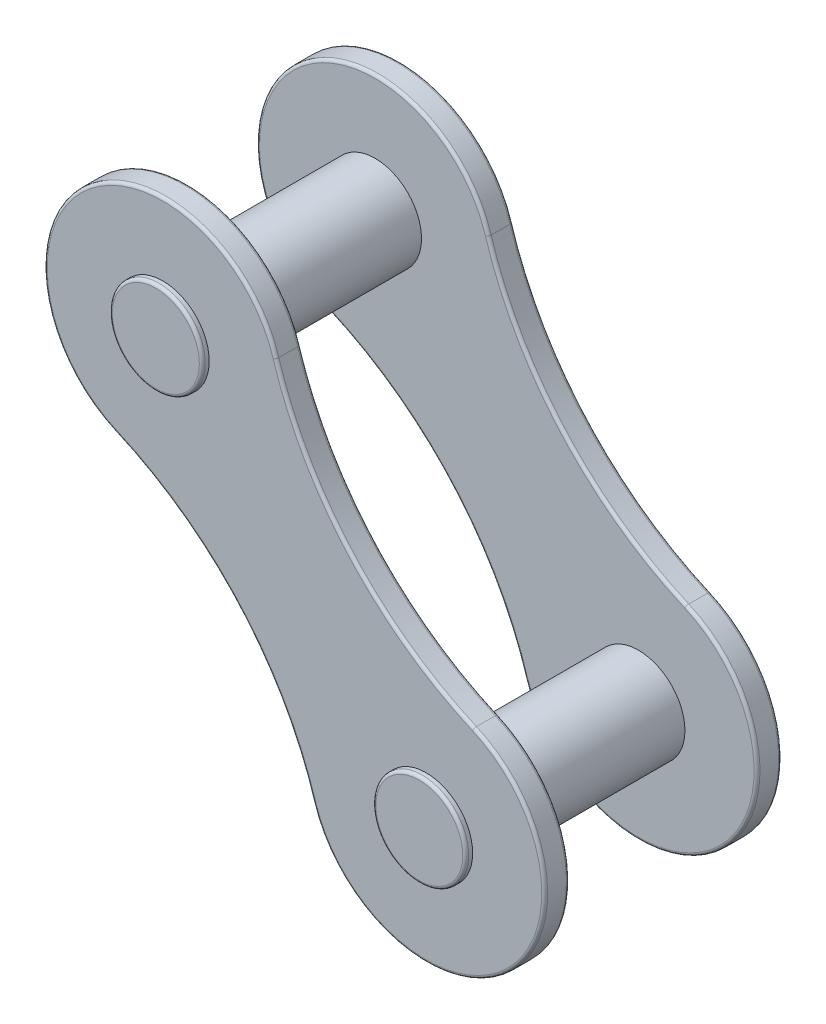
ISO-10303-21;
HEADER;
FILE_DESCRIPTION(('STEP AP214'),'2;1');
FILE_NAME('part.step','',(''),(''),'','','');
FILE_SCHEMA(('AUTOMOTIVE_DESIGN { 1 0 10303 214 1 1 1 1 }'));
ENDSEC;
DATA;
#1=APPLICATION_CONTEXT('core data for automotive mechanical design processes');
#2=APPLICATION_PROTOCOL_DEFINITION('international standard','automotive_design',2000,#1);
#3=PRODUCT_CONTEXT('',#1,'mechanical');
#4=PRODUCT('Part','Part','',(#3));
#5=PRODUCT_RELATED_PRODUCT_CATEGORY('part','',(#4));
#6=PRODUCT_DEFINITION_FORMATION('','',#4);
#7=PRODUCT_DEFINITION_CONTEXT('part definition',#1,'design');
#8=PRODUCT_DEFINITION('design','',#6,#7);
#9=PRODUCT_DEFINITION_SHAPE('','',#8);
#10=(LENGTH_UNIT() NAMED_UNIT(*) SI_UNIT(.MILLI.,.METRE.));
#11=(NAMED_UNIT(*) PLANE_ANGLE_UNIT() SI_UNIT($,.RADIAN.));
#12=(NAMED_UNIT(*) SI_UNIT($,.STERADIAN.) SOLID_ANGLE_UNIT());
#13=UNCERTAINTY_MEASURE_WITH_UNIT(LENGTH_MEASURE(1.E-05),#10,'distance_accuracy_value','');
#14=(GEOMETRIC_REPRESENTATION_CONTEXT(3) GLOBAL_UNCERTAINTY_ASSIGNED_CONTEXT((#13)) GLOBAL_UNIT_ASSIGNED_CONTEXT((#10,
#11,#12)) REPRESENTATION_CONTEXT('',''));
#15=CARTESIAN_POINT('',(0.,0.,0.));
#16=DIRECTION('',(0.,0.,1.));
#17=DIRECTION('',(1.,0.,0.));
#18=AXIS2_PLACEMENT_3D('',#15,#16,#17);
#19=CARTESIAN_POINT('',(45.1534797470327,53.8384460641754,6.35));
#20=DIRECTION('',(0.,0.,-1.));
#21=DIRECTION('',(-1.,0.,0.));
#22=AXIS2_PLACEMENT_3D('',#19,#20,#21);
#23=CYLINDRICAL_SURFACE('',#22,2.35);
#24=CARTESIAN_POINT('',(45.1534797470327,53.8384460641754,4.75));
#25=DIRECTION('',(0.,0.,1.));
#26=DIRECTION('',(1.,0.,0.));
#27=AXIS2_PLACEMENT_3D('',#24,#25,#26);
#28=CIRCLE('',#27,2.35);
#29=CARTESIAN_POINT('',(47.5034797470327,53.8384460641754,4.75));
#30=VERTEX_POINT('',#29);
#31=EDGE_CURVE('E378',#30,#30,#28,.F.);
#32=ORIENTED_EDGE('',*,*,#31,.T.);
#33=EDGE_LOOP('',(#32));
#34=FACE_BOUND('',#33,.T.);
#35=CARTESIAN_POINT('',(45.1534797470327,53.8384460641754,-4.75));
#36=DIRECTION('',(0.,0.,-1.));
#37=DIRECTION('',(-1.,0.,0.));
#38=AXIS2_PLACEMENT_3D('',#35,#36,#37);
#39=CIRCLE('',#38,2.35);
#40=CARTESIAN_POINT('',(42.8034797470327,53.8384460641754,-4.75));
#41=VERTEX_POINT('',#40);
#42=EDGE_CURVE('E193',#41,#41,#39,.T.);
#43=ORIENTED_EDGE('',*,*,#42,.F.);
#44=EDGE_LOOP('',(#43));
#45=FACE_BOUND('',#44,.T.);
#46=ADVANCED_FACE('F36',(#34,#45),#23,.T.);
#47=CARTESIAN_POINT('',(63.2858407210555,49.9374865017428,6.));
#48=DIRECTION('',(0.,0.,1.));
#49=DIRECTION('',(1.,0.,0.));
#50=AXIS2_PLACEMENT_3D('',#47,#48,#49);
#51=PLANE('',#50);
#52=CARTESIAN_POINT('',(58.4924896175519,38.9364054094801,6.));
#53=DIRECTION('',(0.,0.,1.));
#54=DIRECTION('',(1.,0.,0.));
#55=AXIS2_PLACEMENT_3D('',#52,#53,#54);
#56=CIRCLE('',#55,5.85000000000001);
#57=CARTESIAN_POINT('',(52.9043472986548,37.205750786584,6.));
#58=VERTEX_POINT('',#57);
#59=CARTESIAN_POINT('',(60.8292482805099,44.2994324419582,6.));
#60=VERTEX_POINT('',#59);
#61=EDGE_CURVE('E53',#58,#60,#56,.T.);
#62=ORIENTED_EDGE('',*,*,#61,.T.);
#63=CARTESIAN_POINT('',(68.0791918245591,60.9385675940056,6.));
#64=DIRECTION('',(0.,0.,1.));
#65=DIRECTION('',(1.,0.,0.));
#66=AXIS2_PLACEMENT_3D('',#63,#64,#65);
#67=CIRCLE('',#66,18.15);
#68=CARTESIAN_POINT('',(50.7416220659298,55.5691006870715,6.));
#69=VERTEX_POINT('',#68);
#70=EDGE_CURVE('E241',#60,#69,#67,.F.);
#71=ORIENTED_EDGE('',*,*,#70,.T.);
#72=CARTESIAN_POINT('',(45.1534797470327,53.8384460641754,6.));
#73=DIRECTION('',(0.,0.,1.));
#74=DIRECTION('',(1.,0.,0.));
#75=AXIS2_PLACEMENT_3D('',#72,#73,#74);
#76=CIRCLE('',#75,5.85);
#77=CARTESIAN_POINT('',(42.8167210840747,48.4754190316973,6.));
#78=VERTEX_POINT('',#77);
#79=EDGE_CURVE('E237',#69,#78,#76,.T.);
#80=ORIENTED_EDGE('',*,*,#79,.T.);
#81=CARTESIAN_POINT('',(35.5667775400255,31.8362838796499,6.));
#82=DIRECTION('',(0.,0.,1.));
#83=DIRECTION('',(1.,0.,0.));
#84=AXIS2_PLACEMENT_3D('',#81,#82,#83);
#85=CIRCLE('',#84,18.15);
#86=EDGE_CURVE('E58',#78,#58,#85,.F.);
#87=ORIENTED_EDGE('',*,*,#86,.T.);
#88=EDGE_LOOP('',(#62,#71,#80,#87));
#89=FACE_BOUND('',#88,.T.);
#90=CARTESIAN_POINT('',(45.1534797470327,53.8384460641754,6.));
#91=DIRECTION('',(0.,0.,1.));
#92=DIRECTION('',(1.,0.,0.));
#93=AXIS2_PLACEMENT_3D('',#90,#91,#92);
#94=CIRCLE('',#93,2.35);
#95=CARTESIAN_POINT('',(47.5034797470327,53.8384460641754,6.));
#96=VERTEX_POINT('',#95);
#97=EDGE_CURVE('E332',#96,#96,#94,.T.);
#98=ORIENTED_EDGE('',*,*,#97,.F.);
#99=EDGE_LOOP('',(#98));
#100=FACE_BOUND('',#99,.T.);
#101=CARTESIAN_POINT('',(58.4924896175519,38.9364054094801,6.));
#102=DIRECTION('',(0.,0.,1.));
#103=DIRECTION('',(1.,0.,0.));
#104=AXIS2_PLACEMENT_3D('',#101,#102,#103);
#105=CIRCLE('',#104,2.35);
#106=CARTESIAN_POINT('',(60.8424896175519,38.9364054094801,6.));
#107=VERTEX_POINT('',#106);
#108=EDGE_CURVE('E376',#107,#107,#105,.T.);
#109=ORIENTED_EDGE('',*,*,#108,.F.);
#110=EDGE_LOOP('',(#109));
#111=FACE_BOUND('',#110,.T.);
#112=ADVANCED_FACE('F344',(#89,#100,#111),#51,.T.);
#113=CARTESIAN_POINT('',(63.2858407210555,49.9374865017428,4.75));
#114=DIRECTION('',(0.,0.,1.));
#115=DIRECTION('',(1.,0.,0.));
#116=AXIS2_PLACEMENT_3D('',#113,#114,#115);
#117=PLANE('',#116);
#118=CARTESIAN_POINT('',(45.1534797470327,53.8384460641754,4.75));
#119=DIRECTION('',(0.,0.,1.));
#120=DIRECTION('',(1.,0.,0.));
#121=AXIS2_PLACEMENT_3D('',#118,#119,#120);
#122=CIRCLE('',#121,5.85);
#123=CARTESIAN_POINT('',(42.8167210840747,48.4754190316973,4.75));
#124=VERTEX_POINT('',#123);
#125=CARTESIAN_POINT('',(50.7416220659298,55.5691006870715,4.75));
#126=VERTEX_POINT('',#125);
#127=EDGE_CURVE('E220',#124,#126,#122,.F.);
#128=ORIENTED_EDGE('',*,*,#127,.T.);
#129=CARTESIAN_POINT('',(68.0791918245591,60.9385675940056,4.75));
#130=DIRECTION('',(0.,0.,1.));
#131=DIRECTION('',(1.,0.,0.));
#132=AXIS2_PLACEMENT_3D('',#129,#130,#131);
#133=CIRCLE('',#132,18.15);
#134=CARTESIAN_POINT('',(60.8292482805099,44.2994324419582,4.75));
#135=VERTEX_POINT('',#134);
#136=EDGE_CURVE('E226',#126,#135,#133,.T.);
#137=ORIENTED_EDGE('',*,*,#136,.T.);
#138=CARTESIAN_POINT('',(58.4924896175519,38.9364054094801,4.75));
#139=DIRECTION('',(0.,0.,1.));
#140=DIRECTION('',(1.,0.,0.));
#141=AXIS2_PLACEMENT_3D('',#138,#139,#140);
#142=CIRCLE('',#141,5.85000000000001);
#143=CARTESIAN_POINT('',(52.9043472986548,37.205750786584,4.75));
#144=VERTEX_POINT('',#143);
#145=EDGE_CURVE('E224',#135,#144,#142,.F.);
#146=ORIENTED_EDGE('',*,*,#145,.T.);
#147=CARTESIAN_POINT('',(35.5667775400255,31.8362838796499,4.75));
#148=DIRECTION('',(0.,0.,1.));
#149=DIRECTION('',(1.,0.,0.));
#150=AXIS2_PLACEMENT_3D('',#147,#148,#149);
#151=CIRCLE('',#150,18.15);
#152=EDGE_CURVE('E222',#144,#124,#151,.T.);
#153=ORIENTED_EDGE('',*,*,#152,.T.);
#154=EDGE_LOOP('',(#128,#137,#146,#153));
#155=FACE_BOUND('',#154,.T.);
#156=ORIENTED_EDGE('',*,*,#31,.F.);
#157=EDGE_LOOP('',(#156));
#158=FACE_BOUND('',#157,.T.);
#159=CARTESIAN_POINT('',(58.4924896175519,38.9364054094801,4.75));
#160=DIRECTION('',(0.,0.,1.));
#161=DIRECTION('',(1.,0.,0.));
#162=AXIS2_PLACEMENT_3D('',#159,#160,#161);
#163=CIRCLE('',#162,2.35);
#164=CARTESIAN_POINT('',(60.8424896175519,38.9364054094801,4.75));
#165=VERTEX_POINT('',#164);
#166=EDGE_CURVE('E393',#165,#165,#163,.F.);
#167=ORIENTED_EDGE('',*,*,#166,.F.);
#168=EDGE_LOOP('',(#167));
#169=FACE_BOUND('',#168,.T.);
#170=ADVANCED_FACE('F352',(#155,#158,#169),#117,.F.);
#171=CARTESIAN_POINT('',(58.4924896175519,38.9364054094801,6.));
#172=DIRECTION('',(0.,0.,-1.));
#173=DIRECTION('',(-1.,0.,0.));
#174=AXIS2_PLACEMENT_3D('',#171,#172,#173);
#175=CYLINDRICAL_SURFACE('',#174,6.00000000000001);
#176=DIRECTION('',(0.,0.,-1.));
#177=VECTOR('',#176,1.);
#178=CARTESIAN_POINT('',(52.7610615981703,37.1613750270225,6.));
#179=LINE('',#178,#177);
#180=CARTESIAN_POINT('',(52.7610615981703,37.1613750270225,5.85));
#181=VERTEX_POINT('',#180);
#182=CARTESIAN_POINT('',(52.7610615981703,37.1613750270225,4.9));
#183=VERTEX_POINT('',#182);
#184=EDGE_CURVE('E322',#181,#183,#179,.T.);
#185=ORIENTED_EDGE('',*,*,#184,.T.);
#186=CARTESIAN_POINT('',(58.4924896175519,38.9364054094801,4.9));
#187=DIRECTION('',(0.,0.,1.));
#188=DIRECTION('',(1.,0.,0.));
#189=AXIS2_PLACEMENT_3D('',#186,#187,#188);
#190=CIRCLE('',#189,6.00000000000001);
#191=CARTESIAN_POINT('',(60.8891651693037,44.4369459556115,4.9));
#192=VERTEX_POINT('',#191);
#193=EDGE_CURVE('E231',#183,#192,#190,.T.);
#194=ORIENTED_EDGE('',*,*,#193,.T.);
#195=DIRECTION('',(0.,0.,-1.));
#196=VECTOR('',#195,1.);
#197=CARTESIAN_POINT('',(60.8891651693037,44.4369459556115,6.));
#198=LINE('',#197,#196);
#199=CARTESIAN_POINT('',(60.8891651693037,44.4369459556115,5.85));
#200=VERTEX_POINT('',#199);
#201=EDGE_CURVE('E330',#200,#192,#198,.T.);
#202=ORIENTED_EDGE('',*,*,#201,.F.);
#203=CARTESIAN_POINT('',(58.4924896175519,38.9364054094801,5.85));
#204=DIRECTION('',(0.,0.,1.));
#205=DIRECTION('',(1.,0.,0.));
#206=AXIS2_PLACEMENT_3D('',#203,#204,#205);
#207=CIRCLE('',#206,6.00000000000001);
#208=EDGE_CURVE('E229',#200,#181,#207,.F.);
#209=ORIENTED_EDGE('',*,*,#208,.T.);
#210=EDGE_LOOP('',(#185,#194,#202,#209));
#211=FACE_BOUND('',#210,.T.);
#212=ADVANCED_FACE('F424',(#211),#175,.T.);
#213=CARTESIAN_POINT('',(68.0791918245591,60.9385675940056,6.));
#214=DIRECTION('',(0.,0.,-1.));
#215=DIRECTION('',(-1.,0.,0.));
#216=AXIS2_PLACEMENT_3D('',#213,#214,#215);
#217=CYLINDRICAL_SURFACE('',#216,18.);
#218=ORIENTED_EDGE('',*,*,#201,.T.);
#219=CARTESIAN_POINT('',(68.0791918245591,60.9385675940056,4.9));
#220=DIRECTION('',(0.,0.,1.));
#221=DIRECTION('',(1.,0.,0.));
#222=AXIS2_PLACEMENT_3D('',#219,#220,#221);
#223=CIRCLE('',#222,18.);
#224=CARTESIAN_POINT('',(50.8849077664143,55.6134764466329,4.9));
#225=VERTEX_POINT('',#224);
#226=EDGE_CURVE('E217',#192,#225,#223,.F.);
#227=ORIENTED_EDGE('',*,*,#226,.T.);
#228=DIRECTION('',(0.,0.,-1.));
#229=VECTOR('',#228,1.);
#230=CARTESIAN_POINT('',(50.8849077664143,55.6134764466329,6.));
#231=LINE('',#230,#229);
#232=CARTESIAN_POINT('',(50.8849077664143,55.6134764466329,5.85));
#233=VERTEX_POINT('',#232);
#234=EDGE_CURVE('E328',#233,#225,#231,.T.);
#235=ORIENTED_EDGE('',*,*,#234,.F.);
#236=CARTESIAN_POINT('',(68.0791918245591,60.9385675940056,5.85));
#237=DIRECTION('',(0.,0.,1.));
#238=DIRECTION('',(1.,0.,0.));
#239=AXIS2_PLACEMENT_3D('',#236,#237,#238);
#240=CIRCLE('',#239,18.);
#241=EDGE_CURVE('E214',#233,#200,#240,.T.);
#242=ORIENTED_EDGE('',*,*,#241,.T.);
#243=EDGE_LOOP('',(#218,#227,#235,#242));
#244=FACE_BOUND('',#243,.T.);
#245=ADVANCED_FACE('F430',(#244),#217,.F.);
#246=CARTESIAN_POINT('',(45.1534797470327,53.8384460641754,6.));
#247=DIRECTION('',(0.,0.,-1.));
#248=DIRECTION('',(-1.,0.,0.));
#249=AXIS2_PLACEMENT_3D('',#246,#247,#248);
#250=CYLINDRICAL_SURFACE('',#249,6.00000000000001);
#251=ORIENTED_EDGE('',*,*,#234,.T.);
#252=CARTESIAN_POINT('',(45.1534797470327,53.8384460641754,4.9));
#253=DIRECTION('',(0.,0.,1.));
#254=DIRECTION('',(1.,0.,0.));
#255=AXIS2_PLACEMENT_3D('',#252,#253,#254);
#256=CIRCLE('',#255,6.00000000000001);
#257=CARTESIAN_POINT('',(42.7568041952809,48.337905518044,4.9));
#258=VERTEX_POINT('',#257);
#259=EDGE_CURVE('E11',#225,#258,#256,.T.);
#260=ORIENTED_EDGE('',*,*,#259,.T.);
#261=DIRECTION('',(0.,0.,-1.));
#262=VECTOR('',#261,1.);
#263=CARTESIAN_POINT('',(42.7568041952809,48.337905518044,6.));
#264=LINE('',#263,#262);
#265=CARTESIAN_POINT('',(42.7568041952809,48.337905518044,5.85));
#266=VERTEX_POINT('',#265);
#267=EDGE_CURVE('E319',#266,#258,#264,.T.);
#268=ORIENTED_EDGE('',*,*,#267,.F.);
#269=CARTESIAN_POINT('',(45.1534797470327,53.8384460641754,5.85));
#270=DIRECTION('',(0.,0.,1.));
#271=DIRECTION('',(1.,0.,0.));
#272=AXIS2_PLACEMENT_3D('',#269,#270,#271);
#273=CIRCLE('',#272,6.00000000000001);
#274=EDGE_CURVE('E45',#266,#233,#273,.F.);
#275=ORIENTED_EDGE('',*,*,#274,.T.);
#276=EDGE_LOOP('',(#251,#260,#268,#275));
#277=FACE_BOUND('',#276,.T.);
#278=ADVANCED_FACE('F325',(#277),#250,.T.);
#279=CARTESIAN_POINT('',(35.5667775400255,31.8362838796499,6.));
#280=DIRECTION('',(0.,0.,-1.));
#281=DIRECTION('',(-1.,0.,0.));
#282=AXIS2_PLACEMENT_3D('',#279,#280,#281);
#283=CYLINDRICAL_SURFACE('',#282,18.);
#284=ORIENTED_EDGE('',*,*,#267,.T.);
#285=CARTESIAN_POINT('',(35.5667775400255,31.8362838796499,4.9));
#286=DIRECTION('',(0.,0.,1.));
#287=DIRECTION('',(1.,0.,0.));
#288=AXIS2_PLACEMENT_3D('',#285,#286,#287);
#289=CIRCLE('',#288,18.);
#290=EDGE_CURVE('E235',#258,#183,#289,.F.);
#291=ORIENTED_EDGE('',*,*,#290,.T.);
#292=ORIENTED_EDGE('',*,*,#184,.F.);
#293=CARTESIAN_POINT('',(35.5667775400255,31.8362838796499,5.85));
#294=DIRECTION('',(0.,0.,1.));
#295=DIRECTION('',(1.,0.,0.));
#296=AXIS2_PLACEMENT_3D('',#293,#294,#295);
#297=CIRCLE('',#296,18.);
#298=EDGE_CURVE('E233',#181,#266,#297,.T.);
#299=ORIENTED_EDGE('',*,*,#298,.T.);
#300=EDGE_LOOP('',(#284,#291,#292,#299));
#301=FACE_BOUND('',#300,.T.);
#302=ADVANCED_FACE('F318',(#301),#283,.F.);
#303=CARTESIAN_POINT('',(45.1534797470327,53.8384460641754,6.2));
#304=DIRECTION('',(0.,0.,1.));
#305=DIRECTION('',(1.,0.,0.));
#306=AXIS2_PLACEMENT_3D('',#303,#304,#305);
#307=CIRCLE('',#306,2.35);
#308=CARTESIAN_POINT('',(47.5034797470327,53.8384460641754,6.2));
#309=VERTEX_POINT('',#308);
#310=EDGE_CURVE('E268',#309,#309,#307,.F.);
#311=ORIENTED_EDGE('',*,*,#310,.T.);
#312=EDGE_LOOP('',(#311));
#313=FACE_BOUND('',#312,.T.);
#314=ORIENTED_EDGE('',*,*,#97,.T.);
#315=EDGE_LOOP('',(#314));
#316=FACE_BOUND('',#315,.T.);
#317=ADVANCED_FACE('F348',(#313,#316),#23,.T.);
#318=CARTESIAN_POINT('',(45.1534797470327,53.8384460641754,6.35));
#319=DIRECTION('',(0.,0.,1.));
#320=DIRECTION('',(1.,0.,0.));
#321=AXIS2_PLACEMENT_3D('',#318,#319,#320);
#322=PLANE('',#321);
#323=CARTESIAN_POINT('',(45.1534797470327,53.8384460641754,6.35));
#324=DIRECTION('',(0.,0.,1.));
#325=DIRECTION('',(1.,0.,0.));
#326=AXIS2_PLACEMENT_3D('',#323,#324,#325);
#327=CIRCLE('',#326,2.20000000000001);
#328=CARTESIAN_POINT('',(47.3534797470327,53.8384460641754,6.35));
#329=VERTEX_POINT('',#328);
#330=EDGE_CURVE('E265',#329,#329,#327,.T.);
#331=ORIENTED_EDGE('',*,*,#330,.T.);
#332=EDGE_LOOP('',(#331));
#333=FACE_BOUND('',#332,.T.);
#334=ADVANCED_FACE('F361',(#333),#322,.T.);
#335=CARTESIAN_POINT('',(63.2858407210555,49.9374865017428,-6.));
#336=DIRECTION('',(0.,0.,-1.));
#337=DIRECTION('',(1.,0.,0.));
#338=AXIS2_PLACEMENT_3D('',#335,#336,#337);
#339=PLANE('',#338);
#340=CARTESIAN_POINT('',(68.0791918245591,60.9385675940056,-6.));
#341=DIRECTION('',(0.,0.,-1.));
#342=DIRECTION('',(-1.,0.,0.));
#343=AXIS2_PLACEMENT_3D('',#340,#341,#342);
#344=CIRCLE('',#343,18.15);
#345=CARTESIAN_POINT('',(50.7416220659298,55.5691006870715,-6.));
#346=VERTEX_POINT('',#345);
#347=CARTESIAN_POINT('',(60.8292482805099,44.2994324419582,-6.));
#348=VERTEX_POINT('',#347);
#349=EDGE_CURVE('E189',#346,#348,#344,.F.);
#350=ORIENTED_EDGE('',*,*,#349,.T.);
#351=CARTESIAN_POINT('',(58.4924896175519,38.9364054094801,-6.));
#352=DIRECTION('',(0.,0.,-1.));
#353=DIRECTION('',(-1.,0.,0.));
#354=AXIS2_PLACEMENT_3D('',#351,#352,#353);
#355=CIRCLE('',#354,5.85000000000001);
#356=CARTESIAN_POINT('',(52.9043472986548,37.205750786584,-6.));
#357=VERTEX_POINT('',#356);
#358=EDGE_CURVE('E199',#348,#357,#355,.T.);
#359=ORIENTED_EDGE('',*,*,#358,.T.);
#360=CARTESIAN_POINT('',(35.5667775400255,31.8362838796499,-6.));
#361=DIRECTION('',(0.,0.,-1.));
#362=DIRECTION('',(-1.,0.,0.));
#363=AXIS2_PLACEMENT_3D('',#360,#361,#362);
#364=CIRCLE('',#363,18.15);
#365=CARTESIAN_POINT('',(42.8167210840747,48.4754190316973,-6.));
#366=VERTEX_POINT('',#365);
#367=EDGE_CURVE('E179',#357,#366,#364,.F.);
#368=ORIENTED_EDGE('',*,*,#367,.T.);
#369=CARTESIAN_POINT('',(45.1534797470327,53.8384460641754,-6.));
#370=DIRECTION('',(0.,0.,-1.));
#371=DIRECTION('',(-1.,0.,0.));
#372=AXIS2_PLACEMENT_3D('',#369,#370,#371);
#373=CIRCLE('',#372,5.85);
#374=EDGE_CURVE('E191',#366,#346,#373,.T.);
#375=ORIENTED_EDGE('',*,*,#374,.T.);
#376=EDGE_LOOP('',(#350,#359,#368,#375));
#377=FACE_BOUND('',#376,.T.);
#378=CARTESIAN_POINT('',(45.1534797470327,53.8384460641754,-6.));
#379=DIRECTION('',(0.,0.,1.));
#380=DIRECTION('',(1.,0.,0.));
#381=AXIS2_PLACEMENT_3D('',#378,#379,#380);
#382=CIRCLE('',#381,2.35);
#383=CARTESIAN_POINT('',(47.5034797470327,53.8384460641754,-6.));
#384=VERTEX_POINT('',#383);
#385=EDGE_CURVE('E174',#384,#384,#382,.T.);
#386=ORIENTED_EDGE('',*,*,#385,.T.);
#387=EDGE_LOOP('',(#386));
#388=FACE_BOUND('',#387,.T.);
#389=CARTESIAN_POINT('',(58.4924896175519,38.9364054094801,-6.));
#390=DIRECTION('',(0.,0.,-1.));
#391=DIRECTION('',(-1.,0.,0.));
#392=AXIS2_PLACEMENT_3D('',#389,#390,#391);
#393=CIRCLE('',#392,2.35);
#394=CARTESIAN_POINT('',(56.1424896175519,38.9364054094801,-6.));
#395=VERTEX_POINT('',#394);
#396=EDGE_CURVE('E278',#395,#395,#393,.F.);
#397=ORIENTED_EDGE('',*,*,#396,.T.);
#398=EDGE_LOOP('',(#397));
#399=FACE_BOUND('',#398,.T.);
#400=ADVANCED_FACE('F367',(#377,#388,#399),#339,.T.);
#401=CARTESIAN_POINT('',(63.2858407210555,49.9374865017428,-4.75));
#402=DIRECTION('',(0.,0.,-1.));
#403=DIRECTION('',(1.,0.,0.));
#404=AXIS2_PLACEMENT_3D('',#401,#402,#403);
#405=PLANE('',#404);
#406=CARTESIAN_POINT('',(35.5667775400255,31.8362838796499,-4.75));
#407=DIRECTION('',(0.,0.,-1.));
#408=DIRECTION('',(-1.,0.,0.));
#409=AXIS2_PLACEMENT_3D('',#406,#407,#408);
#410=CIRCLE('',#409,18.15);
#411=CARTESIAN_POINT('',(42.8167210840747,48.4754190316973,-4.75));
#412=VERTEX_POINT('',#411);
#413=CARTESIAN_POINT('',(52.9043472986548,37.205750786584,-4.75));
#414=VERTEX_POINT('',#413);
#415=EDGE_CURVE('E209',#412,#414,#410,.T.);
#416=ORIENTED_EDGE('',*,*,#415,.T.);
#417=CARTESIAN_POINT('',(58.4924896175519,38.9364054094801,-4.75));
#418=DIRECTION('',(0.,0.,-1.));
#419=DIRECTION('',(-1.,0.,0.));
#420=AXIS2_PLACEMENT_3D('',#417,#418,#419);
#421=CIRCLE('',#420,5.85000000000001);
#422=CARTESIAN_POINT('',(60.8292482805099,44.2994324419582,-4.75));
#423=VERTEX_POINT('',#422);
#424=EDGE_CURVE('E211',#414,#423,#421,.F.);
#425=ORIENTED_EDGE('',*,*,#424,.T.);
#426=CARTESIAN_POINT('',(68.0791918245591,60.9385675940056,-4.75));
#427=DIRECTION('',(0.,0.,-1.));
#428=DIRECTION('',(-1.,0.,0.));
#429=AXIS2_PLACEMENT_3D('',#426,#427,#428);
#430=CIRCLE('',#429,18.15);
#431=CARTESIAN_POINT('',(50.7416220659298,55.5691006870715,-4.75));
#432=VERTEX_POINT('',#431);
#433=EDGE_CURVE('E205',#423,#432,#430,.T.);
#434=ORIENTED_EDGE('',*,*,#433,.T.);
#435=CARTESIAN_POINT('',(45.1534797470327,53.8384460641754,-4.75));
#436=DIRECTION('',(0.,0.,-1.));
#437=DIRECTION('',(-1.,0.,0.));
#438=AXIS2_PLACEMENT_3D('',#435,#436,#437);
#439=CIRCLE('',#438,5.85);
#440=EDGE_CURVE('E207',#432,#412,#439,.F.);
#441=ORIENTED_EDGE('',*,*,#440,.T.);
#442=EDGE_LOOP('',(#416,#425,#434,#441));
#443=FACE_BOUND('',#442,.T.);
#444=ORIENTED_EDGE('',*,*,#42,.T.);
#445=EDGE_LOOP('',(#444));
#446=FACE_BOUND('',#445,.T.);
#447=CARTESIAN_POINT('',(58.4924896175519,38.9364054094801,-4.75));
#448=DIRECTION('',(0.,0.,1.));
#449=DIRECTION('',(1.,0.,0.));
#450=AXIS2_PLACEMENT_3D('',#447,#448,#449);
#451=CIRCLE('',#450,2.35);
#452=CARTESIAN_POINT('',(60.8424896175519,38.9364054094801,-4.75));
#453=VERTEX_POINT('',#452);
#454=EDGE_CURVE('E390',#453,#453,#451,.T.);
#455=ORIENTED_EDGE('',*,*,#454,.F.);
#456=EDGE_LOOP('',(#455));
#457=FACE_BOUND('',#456,.T.);
#458=ADVANCED_FACE('F340',(#443,#446,#457),#405,.F.);
#459=CARTESIAN_POINT('',(58.4924896175519,38.9364054094801,-6.));
#460=DIRECTION('',(0.,0.,1.));
#461=DIRECTION('',(-1.,0.,0.));
#462=AXIS2_PLACEMENT_3D('',#459,#460,#461);
#463=CYLINDRICAL_SURFACE('',#462,6.00000000000001);
#464=DIRECTION('',(0.,0.,1.));
#465=VECTOR('',#464,1.);
#466=CARTESIAN_POINT('',(52.7610615981703,37.1613750270225,-6.));
#467=LINE('',#466,#465);
#468=CARTESIAN_POINT('',(52.7610615981703,37.1613750270225,-5.85));
#469=VERTEX_POINT('',#468);
#470=CARTESIAN_POINT('',(52.7610615981703,37.1613750270225,-4.9));
#471=VERTEX_POINT('',#470);
#472=EDGE_CURVE('E154',#469,#471,#467,.T.);
#473=ORIENTED_EDGE('',*,*,#472,.F.);
#474=CARTESIAN_POINT('',(58.4924896175519,38.9364054094801,-5.85));
#475=DIRECTION('',(0.,0.,-1.));
#476=DIRECTION('',(-1.,0.,0.));
#477=AXIS2_PLACEMENT_3D('',#474,#475,#476);
#478=CIRCLE('',#477,6.00000000000001);
#479=CARTESIAN_POINT('',(60.8891651693037,44.4369459556115,-5.85));
#480=VERTEX_POINT('',#479);
#481=EDGE_CURVE('E170',#469,#480,#478,.F.);
#482=ORIENTED_EDGE('',*,*,#481,.T.);
#483=DIRECTION('',(0.,0.,1.));
#484=VECTOR('',#483,1.);
#485=CARTESIAN_POINT('',(60.8891651693037,44.4369459556115,-6.));
#486=LINE('',#485,#484);
#487=CARTESIAN_POINT('',(60.8891651693037,44.4369459556115,-4.9));
#488=VERTEX_POINT('',#487);
#489=EDGE_CURVE('E382',#480,#488,#486,.T.);
#490=ORIENTED_EDGE('',*,*,#489,.T.);
#491=CARTESIAN_POINT('',(58.4924896175519,38.9364054094801,-4.9));
#492=DIRECTION('',(0.,0.,-1.));
#493=DIRECTION('',(-1.,0.,0.));
#494=AXIS2_PLACEMENT_3D('',#491,#492,#493);
#495=CIRCLE('',#494,6.00000000000001);
#496=EDGE_CURVE('E173',#488,#471,#495,.T.);
#497=ORIENTED_EDGE('',*,*,#496,.T.);
#498=EDGE_LOOP('',(#473,#482,#490,#497));
#499=FACE_BOUND('',#498,.T.);
#500=ADVANCED_FACE('F167',(#499),#463,.T.);
#501=CARTESIAN_POINT('',(68.0791918245591,60.9385675940056,-6.));
#502=DIRECTION('',(0.,0.,1.));
#503=DIRECTION('',(-1.,0.,0.));
#504=AXIS2_PLACEMENT_3D('',#501,#502,#503);
#505=CYLINDRICAL_SURFACE('',#504,18.);
#506=ORIENTED_EDGE('',*,*,#489,.F.);
#507=CARTESIAN_POINT('',(68.0791918245591,60.9385675940056,-5.85));
#508=DIRECTION('',(0.,0.,-1.));
#509=DIRECTION('',(-1.,0.,0.));
#510=AXIS2_PLACEMENT_3D('',#507,#508,#509);
#511=CIRCLE('',#510,18.);
#512=CARTESIAN_POINT('',(50.8849077664143,55.6134764466329,-5.85));
#513=VERTEX_POINT('',#512);
#514=EDGE_CURVE('E257',#480,#513,#511,.T.);
#515=ORIENTED_EDGE('',*,*,#514,.T.);
#516=DIRECTION('',(0.,0.,1.));
#517=VECTOR('',#516,1.);
#518=CARTESIAN_POINT('',(50.8849077664143,55.6134764466329,-6.));
#519=LINE('',#518,#517);
#520=CARTESIAN_POINT('',(50.8849077664143,55.6134764466329,-4.9));
#521=VERTEX_POINT('',#520);
#522=EDGE_CURVE('E384',#513,#521,#519,.T.);
#523=ORIENTED_EDGE('',*,*,#522,.T.);
#524=CARTESIAN_POINT('',(68.0791918245591,60.9385675940056,-4.9));
#525=DIRECTION('',(0.,0.,-1.));
#526=DIRECTION('',(-1.,0.,0.));
#527=AXIS2_PLACEMENT_3D('',#524,#525,#526);
#528=CIRCLE('',#527,18.);
#529=EDGE_CURVE('E255',#521,#488,#528,.F.);
#530=ORIENTED_EDGE('',*,*,#529,.T.);
#531=EDGE_LOOP('',(#506,#515,#523,#530));
#532=FACE_BOUND('',#531,.T.);
#533=ADVANCED_FACE('F700',(#532),#505,.F.);
#534=CARTESIAN_POINT('',(45.1534797470327,53.8384460641754,-6.));
#535=DIRECTION('',(0.,0.,1.));
#536=DIRECTION('',(-1.,0.,0.));
#537=AXIS2_PLACEMENT_3D('',#534,#535,#536);
#538=CYLINDRICAL_SURFACE('',#537,6.00000000000001);
#539=ORIENTED_EDGE('',*,*,#522,.F.);
#540=CARTESIAN_POINT('',(45.1534797470327,53.8384460641754,-5.85));
#541=DIRECTION('',(0.,0.,-1.));
#542=DIRECTION('',(-1.,0.,0.));
#543=AXIS2_PLACEMENT_3D('',#540,#541,#542);
#544=CIRCLE('',#543,6.00000000000001);
#545=CARTESIAN_POINT('',(42.7568041952809,48.337905518044,-5.85));
#546=VERTEX_POINT('',#545);
#547=EDGE_CURVE('E203',#513,#546,#544,.F.);
#548=ORIENTED_EDGE('',*,*,#547,.T.);
#549=DIRECTION('',(0.,0.,1.));
#550=VECTOR('',#549,1.);
#551=CARTESIAN_POINT('',(42.7568041952809,48.337905518044,-6.));
#552=LINE('',#551,#550);
#553=CARTESIAN_POINT('',(42.7568041952809,48.337905518044,-4.9));
#554=VERTEX_POINT('',#553);
#555=EDGE_CURVE('E156',#546,#554,#552,.T.);
#556=ORIENTED_EDGE('',*,*,#555,.T.);
#557=CARTESIAN_POINT('',(45.1534797470327,53.8384460641754,-4.9));
#558=DIRECTION('',(0.,0.,-1.));
#559=DIRECTION('',(-1.,0.,0.));
#560=AXIS2_PLACEMENT_3D('',#557,#558,#559);
#561=CIRCLE('',#560,6.00000000000001);
#562=EDGE_CURVE('E161',#554,#521,#561,.T.);
#563=ORIENTED_EDGE('',*,*,#562,.T.);
#564=EDGE_LOOP('',(#539,#548,#556,#563));
#565=FACE_BOUND('',#564,.T.);
#566=ADVANCED_FACE('F692',(#565),#538,.T.);
#567=CARTESIAN_POINT('',(35.5667775400255,31.8362838796499,-6.));
#568=DIRECTION('',(0.,0.,1.));
#569=DIRECTION('',(-1.,0.,0.));
#570=AXIS2_PLACEMENT_3D('',#567,#568,#569);
#571=CYLINDRICAL_SURFACE('',#570,18.);
#572=ORIENTED_EDGE('',*,*,#555,.F.);
#573=CARTESIAN_POINT('',(35.5667775400255,31.8362838796499,-5.85));
#574=DIRECTION('',(0.,0.,-1.));
#575=DIRECTION('',(-1.,0.,0.));
#576=AXIS2_PLACEMENT_3D('',#573,#574,#575);
#577=CIRCLE('',#576,18.);
#578=EDGE_CURVE('E151',#546,#469,#577,.T.);
#579=ORIENTED_EDGE('',*,*,#578,.T.);
#580=ORIENTED_EDGE('',*,*,#472,.T.);
#581=CARTESIAN_POINT('',(35.5667775400255,31.8362838796499,-4.9));
#582=DIRECTION('',(0.,0.,-1.));
#583=DIRECTION('',(-1.,0.,0.));
#584=AXIS2_PLACEMENT_3D('',#581,#582,#583);
#585=CIRCLE('',#584,18.);
#586=EDGE_CURVE('E162',#471,#554,#585,.F.);
#587=ORIENTED_EDGE('',*,*,#586,.T.);
#588=EDGE_LOOP('',(#572,#579,#580,#587));
#589=FACE_BOUND('',#588,.T.);
#590=ADVANCED_FACE('F153',(#589),#571,.F.);
#591=CARTESIAN_POINT('',(45.1534797470327,53.8384460641754,-6.35));
#592=DIRECTION('',(0.,0.,1.));
#593=DIRECTION('',(1.,0.,0.));
#594=AXIS2_PLACEMENT_3D('',#591,#592,#593);
#595=PLANE('',#594);
#596=CARTESIAN_POINT('',(45.1534797470327,53.8384460641754,-6.35));
#597=DIRECTION('',(0.,0.,1.));
#598=DIRECTION('',(1.,0.,0.));
#599=AXIS2_PLACEMENT_3D('',#596,#597,#598);
#600=CIRCLE('',#599,2.20000000000001);
#601=CARTESIAN_POINT('',(47.3534797470327,53.8384460641754,-6.35));
#602=VERTEX_POINT('',#601);
#603=EDGE_CURVE('E246',#602,#602,#600,.F.);
#604=ORIENTED_EDGE('',*,*,#603,.T.);
#605=EDGE_LOOP('',(#604));
#606=FACE_BOUND('',#605,.T.);
#607=ADVANCED_FACE('F358',(#606),#595,.F.);
#608=CARTESIAN_POINT('',(45.1534797470327,53.8384460641754,-6.2));
#609=DIRECTION('',(0.,0.,1.));
#610=DIRECTION('',(1.,0.,0.));
#611=AXIS2_PLACEMENT_3D('',#608,#609,#610);
#612=CIRCLE('',#611,2.35);
#613=CARTESIAN_POINT('',(47.5034797470327,53.8384460641754,-6.2));
#614=VERTEX_POINT('',#613);
#615=EDGE_CURVE('E243',#614,#614,#612,.T.);
#616=ORIENTED_EDGE('',*,*,#615,.T.);
#617=EDGE_LOOP('',(#616));
#618=FACE_BOUND('',#617,.T.);
#619=ORIENTED_EDGE('',*,*,#385,.F.);
#620=EDGE_LOOP('',(#619));
#621=FACE_BOUND('',#620,.T.);
#622=ADVANCED_FACE('F347',(#618,#621),#23,.T.);
#623=CARTESIAN_POINT('',(58.4924896175519,38.9364054094801,6.35));
#624=DIRECTION('',(0.,0.,-1.));
#625=DIRECTION('',(-1.,0.,0.));
#626=AXIS2_PLACEMENT_3D('',#623,#624,#625);
#627=CYLINDRICAL_SURFACE('',#626,2.35);
#628=ORIENTED_EDGE('',*,*,#454,.T.);
#629=EDGE_LOOP('',(#628));
#630=FACE_BOUND('',#629,.T.);
#631=ORIENTED_EDGE('',*,*,#166,.T.);
#632=EDGE_LOOP('',(#631));
#633=FACE_BOUND('',#632,.T.);
#634=ADVANCED_FACE('F357',(#630,#633),#627,.T.);
#635=CARTESIAN_POINT('',(58.4924896175519,38.9364054094801,-6.35));
#636=DIRECTION('',(0.,0.,1.));
#637=DIRECTION('',(1.,0.,0.));
#638=AXIS2_PLACEMENT_3D('',#635,#636,#637);
#639=PLANE('',#638);
#640=CARTESIAN_POINT('',(58.4924896175519,38.9364054094801,-6.35));
#641=DIRECTION('',(0.,0.,1.));
#642=DIRECTION('',(1.,0.,0.));
#643=AXIS2_PLACEMENT_3D('',#640,#641,#642);
#644=CIRCLE('',#643,2.20000000000001);
#645=CARTESIAN_POINT('',(60.6924896175519,38.9364054094801,-6.35));
#646=VERTEX_POINT('',#645);
#647=EDGE_CURVE('E252',#646,#646,#644,.F.);
#648=ORIENTED_EDGE('',*,*,#647,.T.);
#649=EDGE_LOOP('',(#648));
#650=FACE_BOUND('',#649,.T.);
#651=ADVANCED_FACE('F403',(#650),#639,.F.);
#652=CARTESIAN_POINT('',(58.4924896175519,38.9364054094801,-6.2));
#653=DIRECTION('',(0.,0.,1.));
#654=DIRECTION('',(1.,0.,0.));
#655=AXIS2_PLACEMENT_3D('',#652,#653,#654);
#656=CIRCLE('',#655,2.35);
#657=CARTESIAN_POINT('',(60.8424896175519,38.9364054094801,-6.2));
#658=VERTEX_POINT('',#657);
#659=EDGE_CURVE('E249',#658,#658,#656,.T.);
#660=ORIENTED_EDGE('',*,*,#659,.T.);
#661=EDGE_LOOP('',(#660));
#662=FACE_BOUND('',#661,.T.);
#663=ORIENTED_EDGE('',*,*,#396,.F.);
#664=EDGE_LOOP('',(#663));
#665=FACE_BOUND('',#664,.T.);
#666=ADVANCED_FACE('F400',(#662,#665),#627,.T.);
#667=CARTESIAN_POINT('',(58.4924896175519,38.9364054094801,6.2));
#668=DIRECTION('',(0.,0.,1.));
#669=DIRECTION('',(1.,0.,0.));
#670=AXIS2_PLACEMENT_3D('',#667,#668,#669);
#671=CIRCLE('',#670,2.35);
#672=CARTESIAN_POINT('',(60.8424896175519,38.9364054094801,6.2));
#673=VERTEX_POINT('',#672);
#674=EDGE_CURVE('E262',#673,#673,#671,.F.);
#675=ORIENTED_EDGE('',*,*,#674,.T.);
#676=EDGE_LOOP('',(#675));
#677=FACE_BOUND('',#676,.T.);
#678=ORIENTED_EDGE('',*,*,#108,.T.);
#679=EDGE_LOOP('',(#678));
#680=FACE_BOUND('',#679,.T.);
#681=ADVANCED_FACE('F402',(#677,#680),#627,.T.);
#682=CARTESIAN_POINT('',(58.4924896175519,38.9364054094801,6.35));
#683=DIRECTION('',(0.,0.,1.));
#684=DIRECTION('',(1.,0.,0.));
#685=AXIS2_PLACEMENT_3D('',#682,#683,#684);
#686=PLANE('',#685);
#687=CARTESIAN_POINT('',(58.4924896175519,38.9364054094801,6.35));
#688=DIRECTION('',(0.,0.,1.));
#689=DIRECTION('',(1.,0.,0.));
#690=AXIS2_PLACEMENT_3D('',#687,#688,#689);
#691=CIRCLE('',#690,2.20000000000001);
#692=CARTESIAN_POINT('',(60.6924896175519,38.9364054094801,6.35));
#693=VERTEX_POINT('',#692);
#694=EDGE_CURVE('E259',#693,#693,#691,.T.);
#695=ORIENTED_EDGE('',*,*,#694,.T.);
#696=EDGE_LOOP('',(#695));
#697=FACE_BOUND('',#696,.T.);
#698=ADVANCED_FACE('F410',(#697),#686,.T.);
#699=CARTESIAN_POINT('',(45.1534797470327,53.8384460641754,-5.85));
#700=DIRECTION('',(0.,0.,-1.));
#701=DIRECTION('',(-1.,0.,0.));
#702=AXIS2_PLACEMENT_3D('',#699,#700,#701);
#703=TOROIDAL_SURFACE('',#702,5.85,0.15);
#704=CARTESIAN_POINT('',(50.7416220659298,55.5691006870715,-5.85));
#705=DIRECTION('',(0.295838397076274,-0.955238003230263,0.));
#706=DIRECTION('',(0.955238003230264,0.295838397076274,0.));
#707=AXIS2_PLACEMENT_3D('',#704,#705,#706);
#708=CIRCLE('',#707,0.15);
#709=EDGE_CURVE('E183',#346,#513,#708,.T.);
#710=ORIENTED_EDGE('',*,*,#709,.F.);
#711=ORIENTED_EDGE('',*,*,#374,.F.);
#712=CARTESIAN_POINT('',(42.8167210840747,48.4754190316973,-5.85));
#713=DIRECTION('',(0.916756757688562,-0.399445925291968,0.));
#714=DIRECTION('',(0.399445925291968,0.916756757688562,0.));
#715=AXIS2_PLACEMENT_3D('',#712,#713,#714);
#716=CIRCLE('',#715,0.15);
#717=EDGE_CURVE('E276',#546,#366,#716,.T.);
#718=ORIENTED_EDGE('',*,*,#717,.F.);
#719=ORIENTED_EDGE('',*,*,#547,.F.);
#720=EDGE_LOOP('',(#710,#711,#718,#719));
#721=FACE_BOUND('',#720,.T.);
#722=ADVANCED_FACE('F449',(#721),#703,.T.);
#723=CARTESIAN_POINT('',(35.5667775400255,31.8362838796499,-5.85));
#724=DIRECTION('',(0.,0.,-1.));
#725=DIRECTION('',(-1.,0.,0.));
#726=AXIS2_PLACEMENT_3D('',#723,#724,#725);
#727=TOROIDAL_SURFACE('',#726,18.15,0.15);
#728=ORIENTED_EDGE('',*,*,#717,.T.);
#729=ORIENTED_EDGE('',*,*,#367,.F.);
#730=CARTESIAN_POINT('',(52.9043472986548,37.205750786584,-5.85));
#731=DIRECTION('',(0.295838397076274,-0.955238003230263,0.));
#732=DIRECTION('',(0.955238003230264,0.295838397076274,0.));
#733=AXIS2_PLACEMENT_3D('',#730,#731,#732);
#734=CIRCLE('',#733,0.15);
#735=EDGE_CURVE('E177',#469,#357,#734,.T.);
#736=ORIENTED_EDGE('',*,*,#735,.F.);
#737=ORIENTED_EDGE('',*,*,#578,.F.);
#738=EDGE_LOOP('',(#728,#729,#736,#737));
#739=FACE_BOUND('',#738,.T.);
#740=ADVANCED_FACE('F178',(#739),#727,.T.);
#741=CARTESIAN_POINT('',(68.0791918245591,60.9385675940056,-5.85));
#742=DIRECTION('',(0.,0.,-1.));
#743=DIRECTION('',(-1.,0.,0.));
#744=AXIS2_PLACEMENT_3D('',#741,#742,#743);
#745=TOROIDAL_SURFACE('',#744,18.15,0.15);
#746=ORIENTED_EDGE('',*,*,#709,.T.);
#747=ORIENTED_EDGE('',*,*,#514,.F.);
#748=CARTESIAN_POINT('',(60.8292482805099,44.2994324419582,-5.85));
#749=DIRECTION('',(0.916756757688562,-0.399445925291968,0.));
#750=DIRECTION('',(0.399445925291968,0.916756757688562,0.));
#751=AXIS2_PLACEMENT_3D('',#748,#749,#750);
#752=CIRCLE('',#751,0.15);
#753=EDGE_CURVE('E184',#348,#480,#752,.T.);
#754=ORIENTED_EDGE('',*,*,#753,.F.);
#755=ORIENTED_EDGE('',*,*,#349,.F.);
#756=EDGE_LOOP('',(#746,#747,#754,#755));
#757=FACE_BOUND('',#756,.T.);
#758=ADVANCED_FACE('F443',(#757),#745,.T.);
#759=CARTESIAN_POINT('',(58.4924896175519,38.9364054094801,-5.85));
#760=DIRECTION('',(0.,0.,-1.));
#761=DIRECTION('',(-1.,0.,0.));
#762=AXIS2_PLACEMENT_3D('',#759,#760,#761);
#763=TOROIDAL_SURFACE('',#762,5.85000000000001,0.15);
#764=ORIENTED_EDGE('',*,*,#735,.T.);
#765=ORIENTED_EDGE('',*,*,#358,.F.);
#766=ORIENTED_EDGE('',*,*,#753,.T.);
#767=ORIENTED_EDGE('',*,*,#481,.F.);
#768=EDGE_LOOP('',(#764,#765,#766,#767));
#769=FACE_BOUND('',#768,.T.);
#770=ADVANCED_FACE('F186',(#769),#763,.T.);
#771=CARTESIAN_POINT('',(45.1534797470327,53.8384460641754,-4.9));
#772=DIRECTION('',(0.,0.,-1.));
#773=DIRECTION('',(-1.,0.,0.));
#774=AXIS2_PLACEMENT_3D('',#771,#772,#773);
#775=TOROIDAL_SURFACE('',#774,5.85,0.15);
#776=CARTESIAN_POINT('',(50.7416220659298,55.5691006870715,-4.9));
#777=DIRECTION('',(0.295838397076274,-0.955238003230263,0.));
#778=DIRECTION('',(0.955238003230264,0.295838397076274,0.));
#779=AXIS2_PLACEMENT_3D('',#776,#777,#778);
#780=CIRCLE('',#779,0.15);
#781=EDGE_CURVE('E284',#521,#432,#780,.T.);
#782=ORIENTED_EDGE('',*,*,#781,.F.);
#783=ORIENTED_EDGE('',*,*,#562,.F.);
#784=CARTESIAN_POINT('',(42.8167210840747,48.4754190316973,-4.9));
#785=DIRECTION('',(0.916756757688562,-0.399445925291968,0.));
#786=DIRECTION('',(0.399445925291968,0.916756757688562,0.));
#787=AXIS2_PLACEMENT_3D('',#784,#785,#786);
#788=CIRCLE('',#787,0.15);
#789=EDGE_CURVE('E272',#412,#554,#788,.T.);
#790=ORIENTED_EDGE('',*,*,#789,.F.);
#791=ORIENTED_EDGE('',*,*,#440,.F.);
#792=EDGE_LOOP('',(#782,#783,#790,#791));
#793=FACE_BOUND('',#792,.T.);
#794=ADVANCED_FACE('F442',(#793),#775,.T.);
#795=CARTESIAN_POINT('',(35.5667775400255,31.8362838796499,-4.9));
#796=DIRECTION('',(0.,0.,-1.));
#797=DIRECTION('',(-1.,0.,0.));
#798=AXIS2_PLACEMENT_3D('',#795,#796,#797);
#799=TOROIDAL_SURFACE('',#798,18.15,0.15);
#800=ORIENTED_EDGE('',*,*,#789,.T.);
#801=ORIENTED_EDGE('',*,*,#586,.F.);
#802=CARTESIAN_POINT('',(52.9043472986548,37.205750786584,-4.9));
#803=DIRECTION('',(0.295838397076274,-0.955238003230263,0.));
#804=DIRECTION('',(0.955238003230264,0.295838397076274,0.));
#805=AXIS2_PLACEMENT_3D('',#802,#803,#804);
#806=CIRCLE('',#805,0.15);
#807=EDGE_CURVE('E281',#414,#471,#806,.T.);
#808=ORIENTED_EDGE('',*,*,#807,.F.);
#809=ORIENTED_EDGE('',*,*,#415,.F.);
#810=EDGE_LOOP('',(#800,#801,#808,#809));
#811=FACE_BOUND('',#810,.T.);
#812=ADVANCED_FACE('F461',(#811),#799,.T.);
#813=CARTESIAN_POINT('',(68.0791918245591,60.9385675940056,-4.9));
#814=DIRECTION('',(0.,0.,-1.));
#815=DIRECTION('',(-1.,0.,0.));
#816=AXIS2_PLACEMENT_3D('',#813,#814,#815);
#817=TOROIDAL_SURFACE('',#816,18.15,0.15);
#818=ORIENTED_EDGE('',*,*,#781,.T.);
#819=ORIENTED_EDGE('',*,*,#433,.F.);
#820=CARTESIAN_POINT('',(60.8292482805099,44.2994324419582,-4.9));
#821=DIRECTION('',(0.916756757688562,-0.399445925291968,0.));
#822=DIRECTION('',(0.399445925291968,0.916756757688562,0.));
#823=AXIS2_PLACEMENT_3D('',#820,#821,#822);
#824=CIRCLE('',#823,0.15);
#825=EDGE_CURVE('E279',#488,#423,#824,.T.);
#826=ORIENTED_EDGE('',*,*,#825,.F.);
#827=ORIENTED_EDGE('',*,*,#529,.F.);
#828=EDGE_LOOP('',(#818,#819,#826,#827));
#829=FACE_BOUND('',#828,.T.);
#830=ADVANCED_FACE('F457',(#829),#817,.T.);
#831=CARTESIAN_POINT('',(58.4924896175519,38.9364054094801,-4.9));
#832=DIRECTION('',(0.,0.,-1.));
#833=DIRECTION('',(-1.,0.,0.));
#834=AXIS2_PLACEMENT_3D('',#831,#832,#833);
#835=TOROIDAL_SURFACE('',#834,5.85000000000001,0.15);
#836=ORIENTED_EDGE('',*,*,#807,.T.);
#837=ORIENTED_EDGE('',*,*,#496,.F.);
#838=ORIENTED_EDGE('',*,*,#825,.T.);
#839=ORIENTED_EDGE('',*,*,#424,.F.);
#840=EDGE_LOOP('',(#836,#837,#838,#839));
#841=FACE_BOUND('',#840,.T.);
#842=ADVANCED_FACE('F453',(#841),#835,.T.);
#843=CARTESIAN_POINT('',(35.5667775400255,31.8362838796499,4.9));
#844=DIRECTION('',(0.,0.,1.));
#845=DIRECTION('',(1.,0.,0.));
#846=AXIS2_PLACEMENT_3D('',#843,#844,#845);
#847=TOROIDAL_SURFACE('',#846,18.15,0.15);
#848=CARTESIAN_POINT('',(42.8167210840747,48.4754190316973,4.9));
#849=DIRECTION('',(-0.916756757688562,0.399445925291968,0.));
#850=DIRECTION('',(-0.399445925291968,-0.916756757688562,0.));
#851=AXIS2_PLACEMENT_3D('',#848,#849,#850);
#852=CIRCLE('',#851,0.15);
#853=EDGE_CURVE('E293',#124,#258,#852,.T.);
#854=ORIENTED_EDGE('',*,*,#853,.F.);
#855=ORIENTED_EDGE('',*,*,#152,.F.);
#856=CARTESIAN_POINT('',(52.9043472986548,37.205750786584,4.9));
#857=DIRECTION('',(0.295838397076274,-0.955238003230263,0.));
#858=DIRECTION('',(0.955238003230264,0.295838397076274,0.));
#859=AXIS2_PLACEMENT_3D('',#856,#857,#858);
#860=CIRCLE('',#859,0.15);
#861=EDGE_CURVE('E282',#183,#144,#860,.T.);
#862=ORIENTED_EDGE('',*,*,#861,.F.);
#863=ORIENTED_EDGE('',*,*,#290,.F.);
#864=EDGE_LOOP('',(#854,#855,#862,#863));
#865=FACE_BOUND('',#864,.T.);
#866=ADVANCED_FACE('F456',(#865),#847,.T.);
#867=CARTESIAN_POINT('',(58.4924896175519,38.9364054094801,4.9));
#868=DIRECTION('',(0.,0.,1.));
#869=DIRECTION('',(1.,0.,0.));
#870=AXIS2_PLACEMENT_3D('',#867,#868,#869);
#871=TOROIDAL_SURFACE('',#870,5.85000000000001,0.15);
#872=ORIENTED_EDGE('',*,*,#861,.T.);
#873=ORIENTED_EDGE('',*,*,#145,.F.);
#874=CARTESIAN_POINT('',(60.8292482805099,44.2994324419582,4.9));
#875=DIRECTION('',(-0.916756757688562,0.399445925291968,0.));
#876=DIRECTION('',(-0.399445925291968,-0.916756757688562,0.));
#877=AXIS2_PLACEMENT_3D('',#874,#875,#876);
#878=CIRCLE('',#877,0.15);
#879=EDGE_CURVE('E291',#192,#135,#878,.T.);
#880=ORIENTED_EDGE('',*,*,#879,.F.);
#881=ORIENTED_EDGE('',*,*,#193,.F.);
#882=EDGE_LOOP('',(#872,#873,#880,#881));
#883=FACE_BOUND('',#882,.T.);
#884=ADVANCED_FACE('F476',(#883),#871,.T.);
#885=CARTESIAN_POINT('',(45.1534797470327,53.8384460641754,4.9));
#886=DIRECTION('',(0.,0.,1.));
#887=DIRECTION('',(1.,0.,0.));
#888=AXIS2_PLACEMENT_3D('',#885,#886,#887);
#889=TOROIDAL_SURFACE('',#888,5.85,0.15);
#890=ORIENTED_EDGE('',*,*,#853,.T.);
#891=ORIENTED_EDGE('',*,*,#259,.F.);
#892=CARTESIAN_POINT('',(50.7416220659298,55.5691006870715,4.9));
#893=DIRECTION('',(0.295838397076274,-0.955238003230263,0.));
#894=DIRECTION('',(0.955238003230264,0.295838397076274,0.));
#895=AXIS2_PLACEMENT_3D('',#892,#893,#894);
#896=CIRCLE('',#895,0.15);
#897=EDGE_CURVE('E289',#126,#225,#896,.T.);
#898=ORIENTED_EDGE('',*,*,#897,.F.);
#899=ORIENTED_EDGE('',*,*,#127,.F.);
#900=EDGE_LOOP('',(#890,#891,#898,#899));
#901=FACE_BOUND('',#900,.T.);
#902=ADVANCED_FACE('F472',(#901),#889,.T.);
#903=CARTESIAN_POINT('',(68.0791918245591,60.9385675940056,4.9));
#904=DIRECTION('',(0.,0.,1.));
#905=DIRECTION('',(1.,0.,0.));
#906=AXIS2_PLACEMENT_3D('',#903,#904,#905);
#907=TOROIDAL_SURFACE('',#906,18.15,0.15);
#908=ORIENTED_EDGE('',*,*,#879,.T.);
#909=ORIENTED_EDGE('',*,*,#136,.F.);
#910=ORIENTED_EDGE('',*,*,#897,.T.);
#911=ORIENTED_EDGE('',*,*,#226,.F.);
#912=EDGE_LOOP('',(#908,#909,#910,#911));
#913=FACE_BOUND('',#912,.T.);
#914=ADVANCED_FACE('F469',(#913),#907,.T.);
#915=CARTESIAN_POINT('',(35.5667775400255,31.8362838796499,5.85));
#916=DIRECTION('',(0.,0.,1.));
#917=DIRECTION('',(1.,0.,0.));
#918=AXIS2_PLACEMENT_3D('',#915,#916,#917);
#919=TOROIDAL_SURFACE('',#918,18.15,0.15);
#920=CARTESIAN_POINT('',(42.8167210840747,48.4754190316973,5.85));
#921=DIRECTION('',(-0.916756757688562,0.399445925291968,0.));
#922=DIRECTION('',(-0.399445925291968,-0.916756757688562,0.));
#923=AXIS2_PLACEMENT_3D('',#920,#921,#922);
#924=CIRCLE('',#923,0.15);
#925=EDGE_CURVE('E301',#266,#78,#924,.T.);
#926=ORIENTED_EDGE('',*,*,#925,.F.);
#927=ORIENTED_EDGE('',*,*,#298,.F.);
#928=CARTESIAN_POINT('',(52.9043472986548,37.205750786584,5.85));
#929=DIRECTION('',(0.295838397076274,-0.955238003230263,0.));
#930=DIRECTION('',(0.955238003230264,0.295838397076274,0.));
#931=AXIS2_PLACEMENT_3D('',#928,#929,#930);
#932=CIRCLE('',#931,0.15);
#933=EDGE_CURVE('E40',#58,#181,#932,.T.);
#934=ORIENTED_EDGE('',*,*,#933,.F.);
#935=ORIENTED_EDGE('',*,*,#86,.F.);
#936=EDGE_LOOP('',(#926,#927,#934,#935));
#937=FACE_BOUND('',#936,.T.);
#938=ADVANCED_FACE('F313',(#937),#919,.T.);
#939=CARTESIAN_POINT('',(58.4924896175519,38.9364054094801,5.85));
#940=DIRECTION('',(0.,0.,1.));
#941=DIRECTION('',(1.,0.,0.));
#942=AXIS2_PLACEMENT_3D('',#939,#940,#941);
#943=TOROIDAL_SURFACE('',#942,5.85000000000001,0.15);
#944=ORIENTED_EDGE('',*,*,#933,.T.);
#945=ORIENTED_EDGE('',*,*,#208,.F.);
#946=CARTESIAN_POINT('',(60.8292482805099,44.2994324419582,5.85));
#947=DIRECTION('',(-0.916756757688562,0.399445925291968,0.));
#948=DIRECTION('',(-0.399445925291968,-0.916756757688562,0.));
#949=AXIS2_PLACEMENT_3D('',#946,#947,#948);
#950=CIRCLE('',#949,0.15);
#951=EDGE_CURVE('E300',#60,#200,#950,.T.);
#952=ORIENTED_EDGE('',*,*,#951,.F.);
#953=ORIENTED_EDGE('',*,*,#61,.F.);
#954=EDGE_LOOP('',(#944,#945,#952,#953));
#955=FACE_BOUND('',#954,.T.);
#956=ADVANCED_FACE('F310',(#955),#943,.T.);
#957=CARTESIAN_POINT('',(45.1534797470327,53.8384460641754,5.85));
#958=DIRECTION('',(0.,0.,1.));
#959=DIRECTION('',(1.,0.,0.));
#960=AXIS2_PLACEMENT_3D('',#957,#958,#959);
#961=TOROIDAL_SURFACE('',#960,5.85,0.15);
#962=ORIENTED_EDGE('',*,*,#925,.T.);
#963=ORIENTED_EDGE('',*,*,#79,.F.);
#964=CARTESIAN_POINT('',(50.7416220659298,55.5691006870715,5.85));
#965=DIRECTION('',(0.295838397076274,-0.955238003230263,0.));
#966=DIRECTION('',(0.955238003230264,0.295838397076274,0.));
#967=AXIS2_PLACEMENT_3D('',#964,#965,#966);
#968=CIRCLE('',#967,0.15);
#969=EDGE_CURVE('E298',#233,#69,#968,.T.);
#970=ORIENTED_EDGE('',*,*,#969,.F.);
#971=ORIENTED_EDGE('',*,*,#274,.F.);
#972=EDGE_LOOP('',(#962,#963,#970,#971));
#973=FACE_BOUND('',#972,.T.);
#974=ADVANCED_FACE('F488',(#973),#961,.T.);
#975=CARTESIAN_POINT('',(68.0791918245591,60.9385675940056,5.85));
#976=DIRECTION('',(0.,0.,1.));
#977=DIRECTION('',(1.,0.,0.));
#978=AXIS2_PLACEMENT_3D('',#975,#976,#977);
#979=TOROIDAL_SURFACE('',#978,18.15,0.15);
#980=ORIENTED_EDGE('',*,*,#951,.T.);
#981=ORIENTED_EDGE('',*,*,#241,.F.);
#982=ORIENTED_EDGE('',*,*,#969,.T.);
#983=ORIENTED_EDGE('',*,*,#70,.F.);
#984=EDGE_LOOP('',(#980,#981,#982,#983));
#985=FACE_BOUND('',#984,.T.);
#986=ADVANCED_FACE('F484',(#985),#979,.T.);
#987=CARTESIAN_POINT('',(45.1534797470327,53.8384460641754,-6.2));
#988=DIRECTION('',(0.,0.,1.));
#989=DIRECTION('',(1.,0.,0.));
#990=AXIS2_PLACEMENT_3D('',#987,#988,#989);
#991=TOROIDAL_SURFACE('',#990,2.20000000000001,0.15);
#992=ORIENTED_EDGE('',*,*,#603,.F.);
#993=EDGE_LOOP('',(#992));
#994=FACE_BOUND('',#993,.T.);
#995=ORIENTED_EDGE('',*,*,#615,.F.);
#996=EDGE_LOOP('',(#995));
#997=FACE_BOUND('',#996,.T.);
#998=ADVANCED_FACE('F487',(#994,#997),#991,.T.);
#999=CARTESIAN_POINT('',(58.4924896175519,38.9364054094801,-6.2));
#1000=DIRECTION('',(0.,0.,1.));
#1001=DIRECTION('',(1.,0.,0.));
#1002=AXIS2_PLACEMENT_3D('',#999,#1000,#1001);
#1003=TOROIDAL_SURFACE('',#1002,2.20000000000001,0.15);
#1004=ORIENTED_EDGE('',*,*,#647,.F.);
#1005=EDGE_LOOP('',(#1004));
#1006=FACE_BOUND('',#1005,.T.);
#1007=ORIENTED_EDGE('',*,*,#659,.F.);
#1008=EDGE_LOOP('',(#1007));
#1009=FACE_BOUND('',#1008,.T.);
#1010=ADVANCED_FACE('F498',(#1006,#1009),#1003,.T.);
#1011=CARTESIAN_POINT('',(58.4924896175519,38.9364054094801,6.2));
#1012=DIRECTION('',(0.,0.,1.));
#1013=DIRECTION('',(1.,0.,0.));
#1014=AXIS2_PLACEMENT_3D('',#1011,#1012,#1013);
#1015=TOROIDAL_SURFACE('',#1014,2.20000000000001,0.15);
#1016=ORIENTED_EDGE('',*,*,#674,.F.);
#1017=EDGE_LOOP('',(#1016));
#1018=FACE_BOUND('',#1017,.T.);
#1019=ORIENTED_EDGE('',*,*,#694,.F.);
#1020=EDGE_LOOP('',(#1019));
#1021=FACE_BOUND('',#1020,.T.);
#1022=ADVANCED_FACE('F501',(#1018,#1021),#1015,.T.);
#1023=CARTESIAN_POINT('',(45.1534797470327,53.8384460641754,6.2));
#1024=DIRECTION('',(0.,0.,1.));
#1025=DIRECTION('',(1.,0.,0.));
#1026=AXIS2_PLACEMENT_3D('',#1023,#1024,#1025);
#1027=TOROIDAL_SURFACE('',#1026,2.20000000000001,0.15);
#1028=ORIENTED_EDGE('',*,*,#310,.F.);
#1029=EDGE_LOOP('',(#1028));
#1030=FACE_BOUND('',#1029,.T.);
#1031=ORIENTED_EDGE('',*,*,#330,.F.);
#1032=EDGE_LOOP('',(#1031));
#1033=FACE_BOUND('',#1032,.T.);
#1034=ADVANCED_FACE('F38',(#1030,#1033),#1027,.T.);
#1035=CLOSED_SHELL('',(#46,#112,#170,#212,#245,#278,#302,#317,#334,#400,#458,#500,#533,#566,
#590,#607,#622,#634,#651,#666,#681,#698,#722,#740,#758,#770,#794,#812,#830,#842,#866,#884,#902,
#914,#938,#956,#974,#986,#998,#1010,#1022,#1034));
#1036=MANIFOLD_SOLID_BREP('B2',#1035);
#1037=ADVANCED_BREP_SHAPE_REPRESENTATION('',(#18,#1036),#14);
#1038=SHAPE_DEFINITION_REPRESENTATION(#9,#1037);
ENDSEC;
END-ISO-10303-21;
